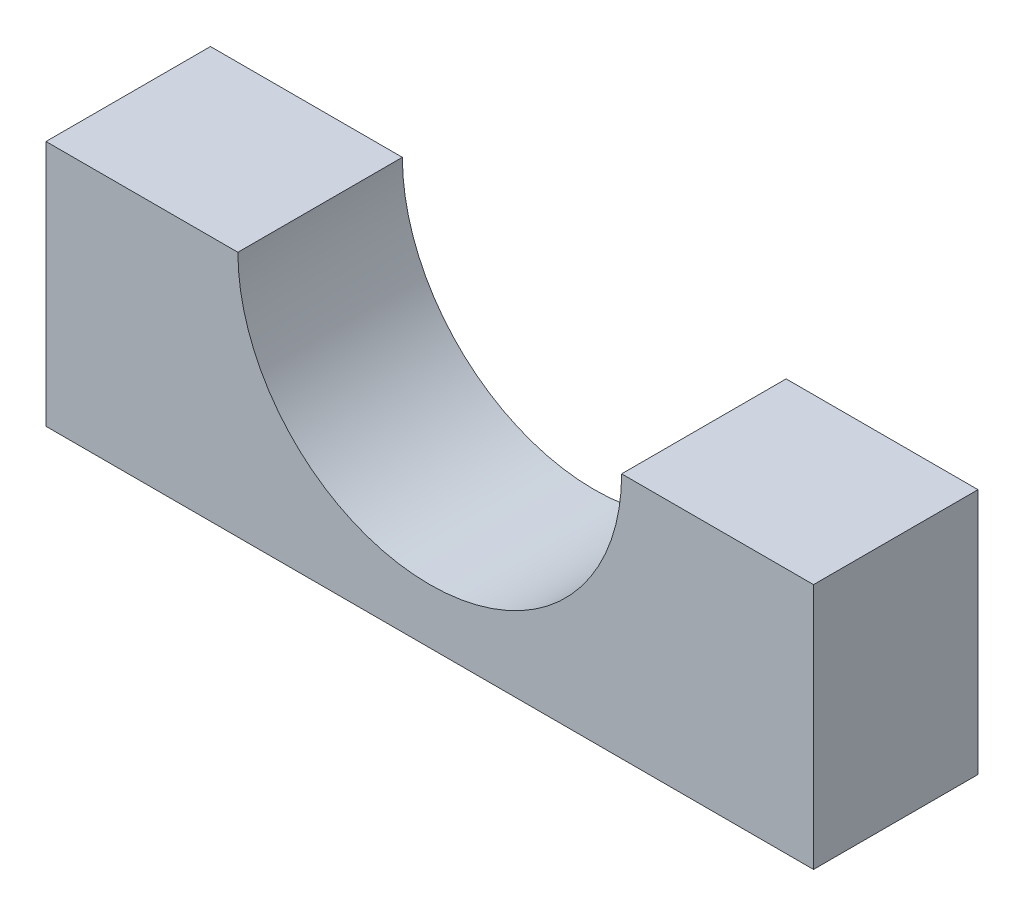
ISO-10303-21;
HEADER;
FILE_DESCRIPTION(('STEP AP214'),'2;1');
FILE_NAME('part.step','',(''),(''),'','','');
FILE_SCHEMA(('AUTOMOTIVE_DESIGN { 1 0 10303 214 1 1 1 1 }'));
ENDSEC;
DATA;
#1=APPLICATION_CONTEXT('core data for automotive mechanical design processes');
#2=APPLICATION_PROTOCOL_DEFINITION('international standard','automotive_design',2000,#1);
#3=PRODUCT_CONTEXT('',#1,'mechanical');
#4=PRODUCT('Part','Part','',(#3));
#5=PRODUCT_RELATED_PRODUCT_CATEGORY('part','',(#4));
#6=PRODUCT_DEFINITION_FORMATION('','',#4);
#7=PRODUCT_DEFINITION_CONTEXT('part definition',#1,'design');
#8=PRODUCT_DEFINITION('design','',#6,#7);
#9=PRODUCT_DEFINITION_SHAPE('','',#8);
#10=(LENGTH_UNIT() NAMED_UNIT(*) SI_UNIT(.MILLI.,.METRE.));
#11=(NAMED_UNIT(*) PLANE_ANGLE_UNIT() SI_UNIT($,.RADIAN.));
#12=(NAMED_UNIT(*) SI_UNIT($,.STERADIAN.) SOLID_ANGLE_UNIT());
#13=UNCERTAINTY_MEASURE_WITH_UNIT(LENGTH_MEASURE(1.E-05),#10,'distance_accuracy_value','');
#14=(GEOMETRIC_REPRESENTATION_CONTEXT(3) GLOBAL_UNCERTAINTY_ASSIGNED_CONTEXT((#13)) GLOBAL_UNIT_ASSIGNED_CONTEXT((#10,
#11,#12)) REPRESENTATION_CONTEXT('',''));
#15=CARTESIAN_POINT('',(0.,0.,0.));
#16=DIRECTION('',(0.,0.,1.));
#17=DIRECTION('',(1.,0.,0.));
#18=AXIS2_PLACEMENT_3D('',#15,#16,#17);
#19=CARTESIAN_POINT('',(-35.,22.5,15.));
#20=DIRECTION('',(0.,1.,0.));
#21=DIRECTION('',(0.,0.,1.));
#22=AXIS2_PLACEMENT_3D('',#19,#20,#21);
#23=PLANE('',#22);
#24=DIRECTION('',(1.,0.,0.));
#25=VECTOR('',#24,1.);
#26=CARTESIAN_POINT('',(-35.,22.5,0.));
#27=LINE('',#26,#25);
#28=CARTESIAN_POINT('',(-35.,22.5,0.));
#29=VERTEX_POINT('',#28);
#30=CARTESIAN_POINT('',(-17.5,22.5,0.));
#31=VERTEX_POINT('',#30);
#32=EDGE_CURVE('E115',#29,#31,#27,.T.);
#33=ORIENTED_EDGE('',*,*,#32,.F.);
#34=DIRECTION('',(0.,0.,-1.));
#35=VECTOR('',#34,1.);
#36=CARTESIAN_POINT('',(-35.,22.5,15.));
#37=LINE('',#36,#35);
#38=CARTESIAN_POINT('',(-35.,22.5,15.));
#39=VERTEX_POINT('',#38);
#40=EDGE_CURVE('E11',#39,#29,#37,.T.);
#41=ORIENTED_EDGE('',*,*,#40,.F.);
#42=DIRECTION('',(1.,0.,0.));
#43=VECTOR('',#42,1.);
#44=CARTESIAN_POINT('',(-35.,22.5,15.));
#45=LINE('',#44,#43);
#46=CARTESIAN_POINT('',(-17.5,22.5,15.));
#47=VERTEX_POINT('',#46);
#48=EDGE_CURVE('E129',#39,#47,#45,.T.);
#49=ORIENTED_EDGE('',*,*,#48,.T.);
#50=DIRECTION('',(0.,0.,-1.));
#51=VECTOR('',#50,1.);
#52=CARTESIAN_POINT('',(-17.5,22.5,15.));
#53=LINE('',#52,#51);
#54=EDGE_CURVE('E36',#47,#31,#53,.T.);
#55=ORIENTED_EDGE('',*,*,#54,.T.);
#56=EDGE_LOOP('',(#33,#41,#49,#55));
#57=FACE_BOUND('',#56,.T.);
#58=ADVANCED_FACE('F33',(#57),#23,.T.);
#59=CARTESIAN_POINT('',(-35.,0.,15.));
#60=DIRECTION('',(-1.,0.,0.));
#61=DIRECTION('',(0.,0.,1.));
#62=AXIS2_PLACEMENT_3D('',#59,#60,#61);
#63=PLANE('',#62);
#64=DIRECTION('',(0.,1.,0.));
#65=VECTOR('',#64,1.);
#66=CARTESIAN_POINT('',(-35.,0.,0.));
#67=LINE('',#66,#65);
#68=CARTESIAN_POINT('',(-35.,0.,0.));
#69=VERTEX_POINT('',#68);
#70=EDGE_CURVE('E127',#69,#29,#67,.T.);
#71=ORIENTED_EDGE('',*,*,#70,.F.);
#72=DIRECTION('',(0.,0.,-1.));
#73=VECTOR('',#72,1.);
#74=CARTESIAN_POINT('',(-35.,0.,15.));
#75=LINE('',#74,#73);
#76=CARTESIAN_POINT('',(-35.,0.,15.));
#77=VERTEX_POINT('',#76);
#78=EDGE_CURVE('E42',#77,#69,#75,.T.);
#79=ORIENTED_EDGE('',*,*,#78,.F.);
#80=DIRECTION('',(0.,1.,0.));
#81=VECTOR('',#80,1.);
#82=CARTESIAN_POINT('',(-35.,0.,15.));
#83=LINE('',#82,#81);
#84=EDGE_CURVE('E110',#77,#39,#83,.T.);
#85=ORIENTED_EDGE('',*,*,#84,.T.);
#86=ORIENTED_EDGE('',*,*,#40,.T.);
#87=EDGE_LOOP('',(#71,#79,#85,#86));
#88=FACE_BOUND('',#87,.T.);
#89=ADVANCED_FACE('F138',(#88),#63,.T.);
#90=CARTESIAN_POINT('',(35.,0.,15.));
#91=DIRECTION('',(0.,-1.,0.));
#92=DIRECTION('',(0.,0.,-1.));
#93=AXIS2_PLACEMENT_3D('',#90,#91,#92);
#94=PLANE('',#93);
#95=DIRECTION('',(-1.,0.,0.));
#96=VECTOR('',#95,1.);
#97=CARTESIAN_POINT('',(35.,0.,0.));
#98=LINE('',#97,#96);
#99=CARTESIAN_POINT('',(35.,0.,0.));
#100=VERTEX_POINT('',#99);
#101=EDGE_CURVE('E96',#100,#69,#98,.T.);
#102=ORIENTED_EDGE('',*,*,#101,.F.);
#103=DIRECTION('',(0.,0.,-1.));
#104=VECTOR('',#103,1.);
#105=CARTESIAN_POINT('',(35.,0.,15.));
#106=LINE('',#105,#104);
#107=CARTESIAN_POINT('',(35.,0.,15.));
#108=VERTEX_POINT('',#107);
#109=EDGE_CURVE('E90',#108,#100,#106,.T.);
#110=ORIENTED_EDGE('',*,*,#109,.F.);
#111=DIRECTION('',(-1.,0.,0.));
#112=VECTOR('',#111,1.);
#113=CARTESIAN_POINT('',(35.,0.,15.));
#114=LINE('',#113,#112);
#115=EDGE_CURVE('E94',#108,#77,#114,.T.);
#116=ORIENTED_EDGE('',*,*,#115,.T.);
#117=ORIENTED_EDGE('',*,*,#78,.T.);
#118=EDGE_LOOP('',(#102,#110,#116,#117));
#119=FACE_BOUND('',#118,.T.);
#120=ADVANCED_FACE('F92',(#119),#94,.T.);
#121=CARTESIAN_POINT('',(35.,0.,15.));
#122=DIRECTION('',(-1.,0.,0.));
#123=DIRECTION('',(0.,0.,1.));
#124=AXIS2_PLACEMENT_3D('',#121,#122,#123);
#125=PLANE('',#124);
#126=DIRECTION('',(0.,1.,0.));
#127=VECTOR('',#126,1.);
#128=CARTESIAN_POINT('',(35.,0.,0.));
#129=LINE('',#128,#127);
#130=CARTESIAN_POINT('',(35.,22.5,0.));
#131=VERTEX_POINT('',#130);
#132=EDGE_CURVE('E124',#100,#131,#129,.T.);
#133=ORIENTED_EDGE('',*,*,#132,.T.);
#134=DIRECTION('',(0.,0.,-1.));
#135=VECTOR('',#134,1.);
#136=CARTESIAN_POINT('',(35.,22.5,15.));
#137=LINE('',#136,#135);
#138=CARTESIAN_POINT('',(35.,22.5,15.));
#139=VERTEX_POINT('',#138);
#140=EDGE_CURVE('E99',#139,#131,#137,.T.);
#141=ORIENTED_EDGE('',*,*,#140,.F.);
#142=DIRECTION('',(0.,1.,0.));
#143=VECTOR('',#142,1.);
#144=CARTESIAN_POINT('',(35.,0.,15.));
#145=LINE('',#144,#143);
#146=EDGE_CURVE('E102',#108,#139,#145,.T.);
#147=ORIENTED_EDGE('',*,*,#146,.F.);
#148=ORIENTED_EDGE('',*,*,#109,.T.);
#149=EDGE_LOOP('',(#133,#141,#147,#148));
#150=FACE_BOUND('',#149,.T.);
#151=ADVANCED_FACE('F103',(#150),#125,.F.);
#152=CARTESIAN_POINT('',(35.,22.5,15.));
#153=DIRECTION('',(0.,-1.,0.));
#154=DIRECTION('',(0.,0.,-1.));
#155=AXIS2_PLACEMENT_3D('',#152,#153,#154);
#156=PLANE('',#155);
#157=DIRECTION('',(-1.,0.,0.));
#158=VECTOR('',#157,1.);
#159=CARTESIAN_POINT('',(35.,22.5,0.));
#160=LINE('',#159,#158);
#161=CARTESIAN_POINT('',(17.5,22.5,0.));
#162=VERTEX_POINT('',#161);
#163=EDGE_CURVE('E121',#131,#162,#160,.T.);
#164=ORIENTED_EDGE('',*,*,#163,.T.);
#165=DIRECTION('',(0.,0.,-1.));
#166=VECTOR('',#165,1.);
#167=CARTESIAN_POINT('',(17.5,22.5,15.));
#168=LINE('',#167,#166);
#169=CARTESIAN_POINT('',(17.5,22.5,15.));
#170=VERTEX_POINT('',#169);
#171=EDGE_CURVE('E132',#170,#162,#168,.T.);
#172=ORIENTED_EDGE('',*,*,#171,.F.);
#173=DIRECTION('',(-1.,0.,0.));
#174=VECTOR('',#173,1.);
#175=CARTESIAN_POINT('',(35.,22.5,15.));
#176=LINE('',#175,#174);
#177=EDGE_CURVE('E107',#139,#170,#176,.T.);
#178=ORIENTED_EDGE('',*,*,#177,.F.);
#179=ORIENTED_EDGE('',*,*,#140,.T.);
#180=EDGE_LOOP('',(#164,#172,#178,#179));
#181=FACE_BOUND('',#180,.T.);
#182=ADVANCED_FACE('F151',(#181),#156,.F.);
#183=CARTESIAN_POINT('',(0.,22.5,15.));
#184=DIRECTION('',(0.,0.,-1.));
#185=DIRECTION('',(-1.,0.,0.));
#186=AXIS2_PLACEMENT_3D('',#183,#184,#185);
#187=CYLINDRICAL_SURFACE('',#186,17.5);
#188=CARTESIAN_POINT('',(0.,22.5,0.));
#189=DIRECTION('',(0.,0.,1.));
#190=DIRECTION('',(1.,0.,0.));
#191=AXIS2_PLACEMENT_3D('',#188,#189,#190);
#192=CIRCLE('',#191,17.5);
#193=EDGE_CURVE('E118',#31,#162,#192,.T.);
#194=ORIENTED_EDGE('',*,*,#193,.F.);
#195=ORIENTED_EDGE('',*,*,#54,.F.);
#196=CARTESIAN_POINT('',(0.,22.5,15.));
#197=DIRECTION('',(0.,0.,1.));
#198=DIRECTION('',(1.,0.,0.));
#199=AXIS2_PLACEMENT_3D('',#196,#197,#198);
#200=CIRCLE('',#199,17.5);
#201=EDGE_CURVE('E203',#47,#170,#200,.T.);
#202=ORIENTED_EDGE('',*,*,#201,.T.);
#203=ORIENTED_EDGE('',*,*,#171,.T.);
#204=EDGE_LOOP('',(#194,#195,#202,#203));
#205=FACE_BOUND('',#204,.T.);
#206=ADVANCED_FACE('F134',(#205),#187,.F.);
#207=CARTESIAN_POINT('',(0.,22.5,15.));
#208=DIRECTION('',(0.,0.,1.));
#209=DIRECTION('',(1.,0.,0.));
#210=AXIS2_PLACEMENT_3D('',#207,#208,#209);
#211=PLANE('',#210);
#212=ORIENTED_EDGE('',*,*,#48,.F.);
#213=ORIENTED_EDGE('',*,*,#84,.F.);
#214=ORIENTED_EDGE('',*,*,#115,.F.);
#215=ORIENTED_EDGE('',*,*,#146,.T.);
#216=ORIENTED_EDGE('',*,*,#177,.T.);
#217=ORIENTED_EDGE('',*,*,#201,.F.);
#218=EDGE_LOOP('',(#212,#213,#214,#215,#216,#217));
#219=FACE_BOUND('',#218,.T.);
#220=ADVANCED_FACE('F109',(#219),#211,.T.);
#221=CARTESIAN_POINT('',(0.,22.5,0.));
#222=DIRECTION('',(0.,0.,1.));
#223=DIRECTION('',(1.,0.,0.));
#224=AXIS2_PLACEMENT_3D('',#221,#222,#223);
#225=PLANE('',#224);
#226=ORIENTED_EDGE('',*,*,#32,.T.);
#227=ORIENTED_EDGE('',*,*,#193,.T.);
#228=ORIENTED_EDGE('',*,*,#163,.F.);
#229=ORIENTED_EDGE('',*,*,#132,.F.);
#230=ORIENTED_EDGE('',*,*,#101,.T.);
#231=ORIENTED_EDGE('',*,*,#70,.T.);
#232=EDGE_LOOP('',(#226,#227,#228,#229,#230,#231));
#233=FACE_BOUND('',#232,.T.);
#234=ADVANCED_FACE('F137',(#233),#225,.F.);
#235=CLOSED_SHELL('',(#58,#89,#120,#151,#182,#206,#220,#234));
#236=MANIFOLD_SOLID_BREP('B2',#235);
#237=ADVANCED_BREP_SHAPE_REPRESENTATION('',(#18,#236),#14);
#238=SHAPE_DEFINITION_REPRESENTATION(#9,#237);
ENDSEC;
END-ISO-10303-21;
